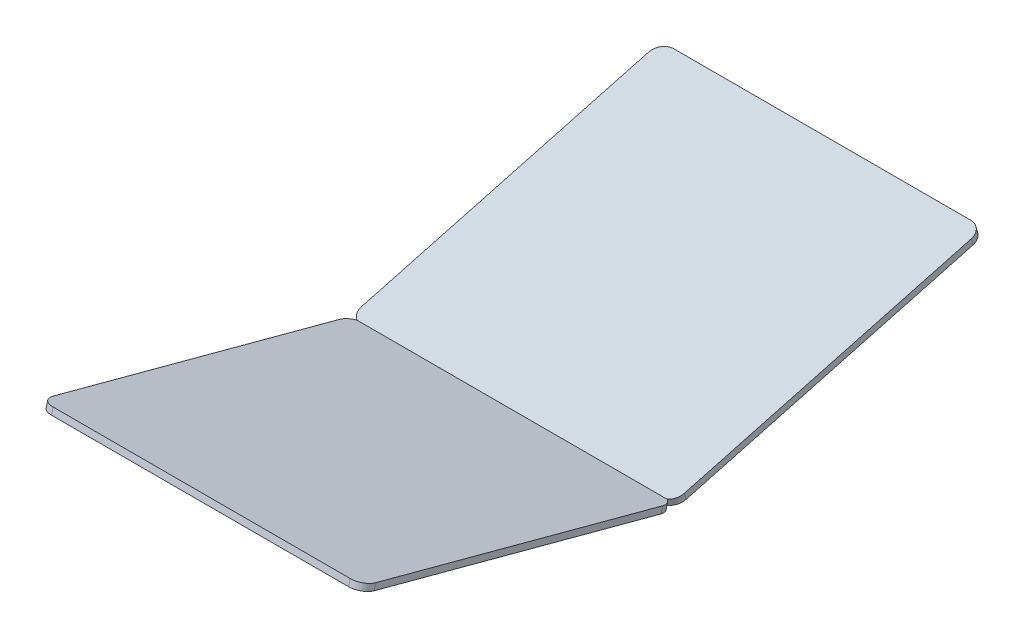
ISO-10303-21;
HEADER;
FILE_DESCRIPTION(('STEP AP214'),'2;1');
FILE_NAME('part.step','',(''),(''),'','','');
FILE_SCHEMA(('AUTOMOTIVE_DESIGN { 1 0 10303 214 1 1 1 1 }'));
ENDSEC;
DATA;
#1=APPLICATION_CONTEXT('core data for automotive mechanical design processes');
#2=APPLICATION_PROTOCOL_DEFINITION('international standard','automotive_design',2000,#1);
#3=PRODUCT_CONTEXT('',#1,'mechanical');
#4=PRODUCT('Part','Part','',(#3));
#5=PRODUCT_RELATED_PRODUCT_CATEGORY('part','',(#4));
#6=PRODUCT_DEFINITION_FORMATION('','',#4);
#7=PRODUCT_DEFINITION_CONTEXT('part definition',#1,'design');
#8=PRODUCT_DEFINITION('design','',#6,#7);
#9=PRODUCT_DEFINITION_SHAPE('','',#8);
#10=(LENGTH_UNIT() NAMED_UNIT(*) SI_UNIT(.MILLI.,.METRE.));
#11=(NAMED_UNIT(*) PLANE_ANGLE_UNIT() SI_UNIT($,.RADIAN.));
#12=(NAMED_UNIT(*) SI_UNIT($,.STERADIAN.) SOLID_ANGLE_UNIT());
#13=UNCERTAINTY_MEASURE_WITH_UNIT(LENGTH_MEASURE(1.E-05),#10,'distance_accuracy_value','');
#14=(GEOMETRIC_REPRESENTATION_CONTEXT(3) GLOBAL_UNCERTAINTY_ASSIGNED_CONTEXT((#13)) GLOBAL_UNIT_ASSIGNED_CONTEXT((#10,
#11,#12)) REPRESENTATION_CONTEXT('',''));
#15=CARTESIAN_POINT('',(0.,0.,0.));
#16=DIRECTION('',(0.,0.,1.));
#17=DIRECTION('',(1.,0.,0.));
#18=AXIS2_PLACEMENT_3D('',#15,#16,#17);
#19=CARTESIAN_POINT('',(-11.5,0.482962913144534,0.129409522551261));
#20=DIRECTION('',(0.,0.258819045102521,-0.965925826289068));
#21=DIRECTION('',(-1.,0.,0.));
#22=AXIS2_PLACEMENT_3D('',#19,#20,#21);
#23=PLANE('',#22);
#24=DIRECTION('',(1.,0.,0.));
#25=VECTOR('',#24,1.);
#26=CARTESIAN_POINT('',(-11.5,0.,0.));
#27=LINE('',#26,#25);
#28=CARTESIAN_POINT('',(-11.5,0.,0.));
#29=VERTEX_POINT('',#28);
#30=CARTESIAN_POINT('',(11.5,0.,0.));
#31=VERTEX_POINT('',#30);
#32=EDGE_CURVE('E98',#29,#31,#27,.T.);
#33=ORIENTED_EDGE('',*,*,#32,.F.);
#34=DIRECTION('',(0.,-0.965925826289068,-0.258819045102521));
#35=VECTOR('',#34,1.);
#36=CARTESIAN_POINT('',(-11.5,0.482962913144534,0.129409522551261));
#37=LINE('',#36,#35);
#38=CARTESIAN_POINT('',(-11.5,0.482962913144534,0.129409522551261));
#39=VERTEX_POINT('',#38);
#40=EDGE_CURVE('E107',#39,#29,#37,.T.);
#41=ORIENTED_EDGE('',*,*,#40,.F.);
#42=DIRECTION('',(1.,0.,0.));
#43=VECTOR('',#42,1.);
#44=CARTESIAN_POINT('',(-11.5,0.482962913144534,0.129409522551261));
#45=LINE('',#44,#43);
#46=CARTESIAN_POINT('',(11.5,0.482962913144534,0.129409522551261));
#47=VERTEX_POINT('',#46);
#48=EDGE_CURVE('E49',#39,#47,#45,.T.);
#49=ORIENTED_EDGE('',*,*,#48,.T.);
#50=DIRECTION('',(0.,-0.965925826289068,-0.258819045102521));
#51=VECTOR('',#50,1.);
#52=CARTESIAN_POINT('',(11.5,0.482962913144534,0.129409522551261));
#53=LINE('',#52,#51);
#54=EDGE_CURVE('E110',#47,#31,#53,.T.);
#55=ORIENTED_EDGE('',*,*,#54,.T.);
#56=EDGE_LOOP('',(#33,#41,#49,#55));
#57=FACE_BOUND('',#56,.T.);
#58=ADVANCED_FACE('F45',(#57),#23,.T.);
#59=CARTESIAN_POINT('',(11.5,0.741781958247055,-0.836516303737807));
#60=DIRECTION('',(0.,-0.965925826289068,-0.258819045102521));
#61=DIRECTION('',(0.,0.258819045102521,-0.965925826289068));
#62=AXIS2_PLACEMENT_3D('',#59,#60,#61);
#63=CYLINDRICAL_SURFACE('',#62,0.999999999999999);
#64=ORIENTED_EDGE('',*,*,#54,.F.);
#65=CARTESIAN_POINT('',(11.5,0.741781958247055,-0.836516303737807));
#66=DIRECTION('',(0.,0.965925826289068,0.258819045102521));
#67=DIRECTION('',(0.,-0.258819045102521,0.965925826289068));
#68=AXIS2_PLACEMENT_3D('',#65,#66,#67);
#69=CIRCLE('',#68,0.999999999999999);
#70=CARTESIAN_POINT('',(12.,0.517638090205041,0.));
#71=VERTEX_POINT('',#70);
#72=EDGE_CURVE('E164',#47,#71,#69,.T.);
#73=ORIENTED_EDGE('',*,*,#72,.T.);
#74=CARTESIAN_POINT('',(11.5,3.86370330515626,0.));
#75=DIRECTION('',(0.,0.,-1.));
#76=DIRECTION('',(0.,-1.,0.));
#77=AXIS2_PLACEMENT_3D('',#74,#75,#76);
#78=ELLIPSE('',#77,3.86370330515626,1.);
#79=EDGE_CURVE('E126',#31,#71,#78,.F.);
#80=ORIENTED_EDGE('',*,*,#79,.F.);
#81=EDGE_LOOP('',(#64,#73,#80));
#82=FACE_BOUND('',#81,.T.);
#83=ADVANCED_FACE('F181',(#82),#63,.F.);
#84=CARTESIAN_POINT('',(-11.5,6.69461999560504,-23.0528103083864));
#85=DIRECTION('',(0.,-0.965925826289068,-0.258819045102521));
#86=DIRECTION('',(0.,0.258819045102521,-0.965925826289068));
#87=AXIS2_PLACEMENT_3D('',#84,#85,#86);
#88=PLANE('',#87);
#89=ORIENTED_EDGE('',*,*,#72,.F.);
#90=ORIENTED_EDGE('',*,*,#48,.F.);
#91=CARTESIAN_POINT('',(-11.5,0.741781958247055,-0.836516303737807));
#92=DIRECTION('',(0.,0.965925826289068,0.258819045102521));
#93=DIRECTION('',(0.,0.258819045102521,-0.965925826289068));
#94=AXIS2_PLACEMENT_3D('',#91,#92,#93);
#95=CIRCLE('',#94,1.);
#96=CARTESIAN_POINT('',(-12.,0.517638090205041,0.));
#97=VERTEX_POINT('',#96);
#98=EDGE_CURVE('E129',#97,#39,#95,.T.);
#99=ORIENTED_EDGE('',*,*,#98,.F.);
#100=DIRECTION('',(-1.,0.,0.));
#101=VECTOR('',#100,1.);
#102=CARTESIAN_POINT('',(-11.5,0.51763809020504,0.));
#103=LINE('',#102,#101);
#104=EDGE_CURVE('E113',#71,#97,#103,.T.);
#105=ORIENTED_EDGE('',*,*,#104,.F.);
#106=EDGE_LOOP('',(#89,#90,#99,#105));
#107=FACE_BOUND('',#106,.T.);
#108=ADVANCED_FACE('F172',(#107),#88,.T.);
#109=CARTESIAN_POINT('',(-11.5,0.741781958247055,-0.836516303737807));
#110=DIRECTION('',(0.,-0.965925826289068,-0.258819045102521));
#111=DIRECTION('',(0.,0.258819045102521,-0.965925826289068));
#112=AXIS2_PLACEMENT_3D('',#109,#110,#111);
#113=CYLINDRICAL_SURFACE('',#112,1.);
#114=ORIENTED_EDGE('',*,*,#98,.T.);
#115=ORIENTED_EDGE('',*,*,#40,.T.);
#116=CARTESIAN_POINT('',(-11.5,3.86370330515626,0.));
#117=DIRECTION('',(0.,0.,-1.));
#118=DIRECTION('',(0.,-1.,0.));
#119=AXIS2_PLACEMENT_3D('',#116,#117,#118);
#120=ELLIPSE('',#119,3.86370330515626,1.);
#121=EDGE_CURVE('E119',#97,#29,#120,.F.);
#122=ORIENTED_EDGE('',*,*,#121,.F.);
#123=EDGE_LOOP('',(#114,#115,#122));
#124=FACE_BOUND('',#123,.T.);
#125=ADVANCED_FACE('F128',(#124),#113,.F.);
#126=CARTESIAN_POINT('',(11.5,6.69461999560504,23.0528103083864));
#127=DIRECTION('',(0.,-0.965925826289068,0.258819045102521));
#128=DIRECTION('',(0.,0.258819045102521,0.965925826289068));
#129=AXIS2_PLACEMENT_3D('',#126,#127,#128);
#130=PLANE('',#129);
#131=CARTESIAN_POINT('',(11.5,0.741781958247055,0.836516303737807));
#132=DIRECTION('',(0.,0.965925826289068,-0.258819045102521));
#133=DIRECTION('',(0.,0.258819045102521,0.965925826289068));
#134=AXIS2_PLACEMENT_3D('',#131,#132,#133);
#135=CIRCLE('',#134,1.);
#136=CARTESIAN_POINT('',(12.5,0.741781958247055,0.836516303737807));
#137=VERTEX_POINT('',#136);
#138=EDGE_CURVE('E154',#137,#71,#135,.T.);
#139=ORIENTED_EDGE('',*,*,#138,.T.);
#140=ORIENTED_EDGE('',*,*,#104,.T.);
#141=CARTESIAN_POINT('',(-11.5,0.741781958247055,0.836516303737807));
#142=DIRECTION('',(0.,0.965925826289068,-0.258819045102521));
#143=DIRECTION('',(0.,-0.258819045102521,-0.965925826289068));
#144=AXIS2_PLACEMENT_3D('',#141,#142,#143);
#145=CIRCLE('',#144,0.999999999999999);
#146=CARTESIAN_POINT('',(-12.5,0.741781958247055,0.836516303737807));
#147=VERTEX_POINT('',#146);
#148=EDGE_CURVE('E123',#97,#147,#145,.T.);
#149=ORIENTED_EDGE('',*,*,#148,.T.);
#150=DIRECTION('',(0.,0.258819045102521,0.965925826289068));
#151=VECTOR('',#150,1.);
#152=CARTESIAN_POINT('',(-12.5,0.741781958247055,0.836516303737807));
#153=LINE('',#152,#151);
#154=CARTESIAN_POINT('',(-12.5,6.69461999560504,23.0528103083864));
#155=VERTEX_POINT('',#154);
#156=EDGE_CURVE('E149',#147,#155,#153,.T.);
#157=ORIENTED_EDGE('',*,*,#156,.T.);
#158=CARTESIAN_POINT('',(-11.5,6.69461999560504,23.0528103083864));
#159=DIRECTION('',(0.,0.965925826289068,-0.258819045102521));
#160=DIRECTION('',(0.,-0.258819045102521,-0.965925826289068));
#161=AXIS2_PLACEMENT_3D('',#158,#159,#160);
#162=CIRCLE('',#161,1.);
#163=CARTESIAN_POINT('',(-11.5,6.95343904070757,24.0187361346754));
#164=VERTEX_POINT('',#163);
#165=EDGE_CURVE('E146',#155,#164,#162,.T.);
#166=ORIENTED_EDGE('',*,*,#165,.T.);
#167=DIRECTION('',(1.,0.,0.));
#168=VECTOR('',#167,1.);
#169=CARTESIAN_POINT('',(11.5,6.95343904070757,24.0187361346754));
#170=LINE('',#169,#168);
#171=CARTESIAN_POINT('',(11.5,6.95343904070757,24.0187361346754));
#172=VERTEX_POINT('',#171);
#173=EDGE_CURVE('E144',#164,#172,#170,.T.);
#174=ORIENTED_EDGE('',*,*,#173,.T.);
#175=CARTESIAN_POINT('',(11.5,6.69461999560504,23.0528103083864));
#176=DIRECTION('',(0.,0.965925826289068,-0.258819045102521));
#177=DIRECTION('',(0.,0.258819045102521,0.965925826289068));
#178=AXIS2_PLACEMENT_3D('',#175,#176,#177);
#179=CIRCLE('',#178,1.);
#180=CARTESIAN_POINT('',(12.5,6.69461999560504,23.0528103083864));
#181=VERTEX_POINT('',#180);
#182=EDGE_CURVE('E153',#172,#181,#179,.T.);
#183=ORIENTED_EDGE('',*,*,#182,.T.);
#184=DIRECTION('',(0.,-0.258819045102521,-0.965925826289068));
#185=VECTOR('',#184,1.);
#186=CARTESIAN_POINT('',(12.5,0.741781958247055,0.836516303737807));
#187=LINE('',#186,#185);
#188=EDGE_CURVE('E151',#181,#137,#187,.T.);
#189=ORIENTED_EDGE('',*,*,#188,.T.);
#190=EDGE_LOOP('',(#139,#140,#149,#157,#166,#174,#183,#189));
#191=FACE_BOUND('',#190,.T.);
#192=ADVANCED_FACE('F174',(#191),#130,.F.);
#193=CARTESIAN_POINT('',(11.5,0.741781958247055,0.836516303737807));
#194=DIRECTION('',(0.,-0.965925826289068,0.258819045102521));
#195=DIRECTION('',(0.,0.258819045102521,0.965925826289068));
#196=AXIS2_PLACEMENT_3D('',#193,#194,#195);
#197=CYLINDRICAL_SURFACE('',#196,1.);
#198=CARTESIAN_POINT('',(11.5,0.258819045102521,0.965925826289068));
#199=DIRECTION('',(0.,0.965925826289068,-0.258819045102521));
#200=DIRECTION('',(0.,0.258819045102521,0.965925826289068));
#201=AXIS2_PLACEMENT_3D('',#198,#199,#200);
#202=CIRCLE('',#201,1.);
#203=CARTESIAN_POINT('',(12.5,0.258819045102521,0.965925826289068));
#204=VERTEX_POINT('',#203);
#205=EDGE_CURVE('E136',#204,#31,#202,.T.);
#206=ORIENTED_EDGE('',*,*,#205,.T.);
#207=ORIENTED_EDGE('',*,*,#79,.T.);
#208=ORIENTED_EDGE('',*,*,#138,.F.);
#209=DIRECTION('',(0.,-0.965925826289068,0.258819045102521));
#210=VECTOR('',#209,1.);
#211=CARTESIAN_POINT('',(12.5,0.741781958247055,0.836516303737807));
#212=LINE('',#211,#210);
#213=EDGE_CURVE('E180',#137,#204,#212,.T.);
#214=ORIENTED_EDGE('',*,*,#213,.T.);
#215=EDGE_LOOP('',(#206,#207,#208,#214));
#216=FACE_BOUND('',#215,.T.);
#217=ADVANCED_FACE('F179',(#216),#197,.T.);
#218=CARTESIAN_POINT('',(-11.5,0.741781958247055,0.836516303737807));
#219=DIRECTION('',(0.,-0.965925826289068,0.258819045102521));
#220=DIRECTION('',(0.,0.258819045102521,0.965925826289068));
#221=AXIS2_PLACEMENT_3D('',#218,#219,#220);
#222=CYLINDRICAL_SURFACE('',#221,0.999999999999999);
#223=ORIENTED_EDGE('',*,*,#148,.F.);
#224=ORIENTED_EDGE('',*,*,#121,.T.);
#225=CARTESIAN_POINT('',(-11.5,0.258819045102521,0.965925826289067));
#226=DIRECTION('',(0.,0.965925826289068,-0.258819045102521));
#227=DIRECTION('',(0.,-0.258819045102521,-0.965925826289068));
#228=AXIS2_PLACEMENT_3D('',#225,#226,#227);
#229=CIRCLE('',#228,0.999999999999999);
#230=CARTESIAN_POINT('',(-12.5,0.258819045102521,0.965925826289067));
#231=VERTEX_POINT('',#230);
#232=EDGE_CURVE('E121',#29,#231,#229,.T.);
#233=ORIENTED_EDGE('',*,*,#232,.T.);
#234=DIRECTION('',(0.,-0.965925826289068,0.258819045102521));
#235=VECTOR('',#234,1.);
#236=CARTESIAN_POINT('',(-12.5,0.741781958247055,0.836516303737807));
#237=LINE('',#236,#235);
#238=EDGE_CURVE('E320',#147,#231,#237,.T.);
#239=ORIENTED_EDGE('',*,*,#238,.F.);
#240=EDGE_LOOP('',(#223,#224,#233,#239));
#241=FACE_BOUND('',#240,.T.);
#242=ADVANCED_FACE('F47',(#241),#222,.T.);
#243=CARTESIAN_POINT('',(11.5,6.69461999560504,23.0528103083864));
#244=DIRECTION('',(0.,-0.965925826289068,0.258819045102521));
#245=DIRECTION('',(0.,0.258819045102521,0.965925826289068));
#246=AXIS2_PLACEMENT_3D('',#243,#244,#245);
#247=CYLINDRICAL_SURFACE('',#246,1.);
#248=CARTESIAN_POINT('',(11.5,6.21165708246051,23.1822198309376));
#249=DIRECTION('',(0.,0.965925826289068,-0.258819045102521));
#250=DIRECTION('',(0.,0.258819045102521,0.965925826289068));
#251=AXIS2_PLACEMENT_3D('',#248,#249,#250);
#252=CIRCLE('',#251,1.);
#253=CARTESIAN_POINT('',(11.5,6.47047612756303,24.1481456572267));
#254=VERTEX_POINT('',#253);
#255=CARTESIAN_POINT('',(12.5,6.21165708246051,23.1822198309376));
#256=VERTEX_POINT('',#255);
#257=EDGE_CURVE('E12',#254,#256,#252,.T.);
#258=ORIENTED_EDGE('',*,*,#257,.T.);
#259=DIRECTION('',(0.,-0.965925826289068,0.258819045102521));
#260=VECTOR('',#259,1.);
#261=CARTESIAN_POINT('',(12.5,6.69461999560504,23.0528103083864));
#262=LINE('',#261,#260);
#263=EDGE_CURVE('E112',#181,#256,#262,.T.);
#264=ORIENTED_EDGE('',*,*,#263,.F.);
#265=ORIENTED_EDGE('',*,*,#182,.F.);
#266=DIRECTION('',(0.,-0.965925826289068,0.258819045102521));
#267=VECTOR('',#266,1.);
#268=CARTESIAN_POINT('',(11.5,6.95343904070757,24.0187361346754));
#269=LINE('',#268,#267);
#270=EDGE_CURVE('E147',#172,#254,#269,.T.);
#271=ORIENTED_EDGE('',*,*,#270,.T.);
#272=EDGE_LOOP('',(#258,#264,#265,#271));
#273=FACE_BOUND('',#272,.T.);
#274=ADVANCED_FACE('F197',(#273),#247,.T.);
#275=CARTESIAN_POINT('',(12.5,0.741781958247055,0.836516303737807));
#276=DIRECTION('',(-1.,0.,0.));
#277=DIRECTION('',(0.,0.258819045102521,0.965925826289068));
#278=AXIS2_PLACEMENT_3D('',#275,#276,#277);
#279=PLANE('',#278);
#280=DIRECTION('',(0.,-0.258819045102521,-0.965925826289068));
#281=VECTOR('',#280,1.);
#282=CARTESIAN_POINT('',(12.5,0.258819045102521,0.965925826289068));
#283=LINE('',#282,#281);
#284=EDGE_CURVE('E55',#256,#204,#283,.T.);
#285=ORIENTED_EDGE('',*,*,#284,.T.);
#286=ORIENTED_EDGE('',*,*,#213,.F.);
#287=ORIENTED_EDGE('',*,*,#188,.F.);
#288=ORIENTED_EDGE('',*,*,#263,.T.);
#289=EDGE_LOOP('',(#285,#286,#287,#288));
#290=FACE_BOUND('',#289,.T.);
#291=ADVANCED_FACE('F201',(#290),#279,.F.);
#292=CARTESIAN_POINT('',(-12.5,0.741781958247055,0.836516303737807));
#293=DIRECTION('',(1.,0.,0.));
#294=DIRECTION('',(0.,-0.258819045102521,-0.965925826289068));
#295=AXIS2_PLACEMENT_3D('',#292,#293,#294);
#296=PLANE('',#295);
#297=DIRECTION('',(0.,0.258819045102521,0.965925826289068));
#298=VECTOR('',#297,1.);
#299=CARTESIAN_POINT('',(-12.5,0.258819045102521,0.965925826289067));
#300=LINE('',#299,#298);
#301=CARTESIAN_POINT('',(-12.5,6.21165708246051,23.1822198309376));
#302=VERTEX_POINT('',#301);
#303=EDGE_CURVE('E135',#231,#302,#300,.T.);
#304=ORIENTED_EDGE('',*,*,#303,.T.);
#305=DIRECTION('',(0.,-0.965925826289068,0.258819045102521));
#306=VECTOR('',#305,1.);
#307=CARTESIAN_POINT('',(-12.5,6.69461999560504,23.0528103083864));
#308=LINE('',#307,#306);
#309=EDGE_CURVE('E308',#155,#302,#308,.T.);
#310=ORIENTED_EDGE('',*,*,#309,.F.);
#311=ORIENTED_EDGE('',*,*,#156,.F.);
#312=ORIENTED_EDGE('',*,*,#238,.T.);
#313=EDGE_LOOP('',(#304,#310,#311,#312));
#314=FACE_BOUND('',#313,.T.);
#315=ADVANCED_FACE('F207',(#314),#296,.F.);
#316=CARTESIAN_POINT('',(-11.5,6.69461999560504,23.0528103083864));
#317=DIRECTION('',(0.,-0.965925826289068,0.258819045102521));
#318=DIRECTION('',(0.,0.258819045102521,0.965925826289068));
#319=AXIS2_PLACEMENT_3D('',#316,#317,#318);
#320=CYLINDRICAL_SURFACE('',#319,1.);
#321=CARTESIAN_POINT('',(-11.5,6.21165708246051,23.1822198309376));
#322=DIRECTION('',(0.,0.965925826289068,-0.258819045102521));
#323=DIRECTION('',(0.,-0.258819045102521,-0.965925826289068));
#324=AXIS2_PLACEMENT_3D('',#321,#322,#323);
#325=CIRCLE('',#324,1.);
#326=CARTESIAN_POINT('',(-11.5,6.47047612756303,24.1481456572267));
#327=VERTEX_POINT('',#326);
#328=EDGE_CURVE('E139',#302,#327,#325,.T.);
#329=ORIENTED_EDGE('',*,*,#328,.T.);
#330=DIRECTION('',(0.,-0.965925826289068,0.258819045102521));
#331=VECTOR('',#330,1.);
#332=CARTESIAN_POINT('',(-11.5,6.95343904070757,24.0187361346754));
#333=LINE('',#332,#331);
#334=EDGE_CURVE('E303',#164,#327,#333,.T.);
#335=ORIENTED_EDGE('',*,*,#334,.F.);
#336=ORIENTED_EDGE('',*,*,#165,.F.);
#337=ORIENTED_EDGE('',*,*,#309,.T.);
#338=EDGE_LOOP('',(#329,#335,#336,#337));
#339=FACE_BOUND('',#338,.T.);
#340=ADVANCED_FACE('F213',(#339),#320,.T.);
#341=CARTESIAN_POINT('',(11.5,6.95343904070757,24.0187361346754));
#342=DIRECTION('',(0.,-0.258819045102521,-0.965925826289068));
#343=DIRECTION('',(-1.,0.,0.));
#344=AXIS2_PLACEMENT_3D('',#341,#342,#343);
#345=PLANE('',#344);
#346=DIRECTION('',(1.,0.,0.));
#347=VECTOR('',#346,1.);
#348=CARTESIAN_POINT('',(11.5,6.47047612756303,24.1481456572267));
#349=LINE('',#348,#347);
#350=EDGE_CURVE('E157',#327,#254,#349,.T.);
#351=ORIENTED_EDGE('',*,*,#350,.T.);
#352=ORIENTED_EDGE('',*,*,#270,.F.);
#353=ORIENTED_EDGE('',*,*,#173,.F.);
#354=ORIENTED_EDGE('',*,*,#334,.T.);
#355=EDGE_LOOP('',(#351,#352,#353,#354));
#356=FACE_BOUND('',#355,.T.);
#357=ADVANCED_FACE('F217',(#356),#345,.F.);
#358=CARTESIAN_POINT('',(11.5,6.21165708246051,23.1822198309376));
#359=DIRECTION('',(0.,-0.965925826289068,0.258819045102521));
#360=DIRECTION('',(0.,0.258819045102521,0.965925826289068));
#361=AXIS2_PLACEMENT_3D('',#358,#359,#360);
#362=PLANE('',#361);
#363=ORIENTED_EDGE('',*,*,#257,.F.);
#364=ORIENTED_EDGE('',*,*,#350,.F.);
#365=ORIENTED_EDGE('',*,*,#328,.F.);
#366=ORIENTED_EDGE('',*,*,#303,.F.);
#367=ORIENTED_EDGE('',*,*,#232,.F.);
#368=ORIENTED_EDGE('',*,*,#32,.T.);
#369=ORIENTED_EDGE('',*,*,#205,.F.);
#370=ORIENTED_EDGE('',*,*,#284,.F.);
#371=EDGE_LOOP('',(#363,#364,#365,#366,#367,#368,#369,#370));
#372=FACE_BOUND('',#371,.T.);
#373=ADVANCED_FACE('F132',(#372),#362,.T.);
#374=CLOSED_SHELL('',(#58,#83,#108,#125,#192,#217,#242,#274,#291,#315,#340,#357,#373));
#375=MANIFOLD_SOLID_BREP('B2',#374);
#376=CARTESIAN_POINT('',(11.5,0.482962913144534,-0.129409522551261));
#377=DIRECTION('',(0.,0.258819045102521,0.965925826289068));
#378=DIRECTION('',(1.,0.,0.));
#379=AXIS2_PLACEMENT_3D('',#376,#377,#378);
#380=PLANE('',#379);
#381=DIRECTION('',(1.,0.,0.));
#382=VECTOR('',#381,1.);
#383=CARTESIAN_POINT('',(-11.5,0.,0.));
#384=LINE('',#383,#382);
#385=CARTESIAN_POINT('',(-11.5,0.,0.));
#386=VERTEX_POINT('',#385);
#387=CARTESIAN_POINT('',(11.5,0.,0.));
#388=VERTEX_POINT('',#387);
#389=EDGE_CURVE('E436',#386,#388,#384,.T.);
#390=ORIENTED_EDGE('',*,*,#389,.T.);
#391=DIRECTION('',(0.,-0.965925826289068,0.258819045102521));
#392=VECTOR('',#391,1.);
#393=CARTESIAN_POINT('',(11.5,0.482962913144534,-0.129409522551261));
#394=LINE('',#393,#392);
#395=CARTESIAN_POINT('',(11.5,0.482962913144534,-0.129409522551261));
#396=VERTEX_POINT('',#395);
#397=EDGE_CURVE('E442',#396,#388,#394,.T.);
#398=ORIENTED_EDGE('',*,*,#397,.F.);
#399=DIRECTION('',(-1.,0.,0.));
#400=VECTOR('',#399,1.);
#401=CARTESIAN_POINT('',(11.5,0.482962913144534,-0.129409522551261));
#402=LINE('',#401,#400);
#403=CARTESIAN_POINT('',(-11.5,0.482962913144534,-0.129409522551261));
#404=VERTEX_POINT('',#403);
#405=EDGE_CURVE('E336',#396,#404,#402,.T.);
#406=ORIENTED_EDGE('',*,*,#405,.T.);
#407=DIRECTION('',(0.,-0.965925826289068,0.258819045102521));
#408=VECTOR('',#407,1.);
#409=CARTESIAN_POINT('',(-11.5,0.482962913144534,-0.129409522551261));
#410=LINE('',#409,#408);
#411=EDGE_CURVE('E351',#404,#386,#410,.T.);
#412=ORIENTED_EDGE('',*,*,#411,.T.);
#413=EDGE_LOOP('',(#390,#398,#406,#412));
#414=FACE_BOUND('',#413,.T.);
#415=ADVANCED_FACE('F327',(#414),#380,.T.);
#416=CARTESIAN_POINT('',(-11.5,0.741781958247055,0.836516303737807));
#417=DIRECTION('',(0.,-0.965925826289068,0.258819045102521));
#418=DIRECTION('',(0.,0.258819045102521,0.965925826289068));
#419=AXIS2_PLACEMENT_3D('',#416,#417,#418);
#420=CYLINDRICAL_SURFACE('',#419,0.999999999999999);
#421=CARTESIAN_POINT('',(-11.5,3.86370330515626,0.));
#422=DIRECTION('',(0.,0.,-1.));
#423=DIRECTION('',(0.,-1.,0.));
#424=AXIS2_PLACEMENT_3D('',#421,#422,#423);
#425=ELLIPSE('',#424,3.86370330515626,1.);
#426=CARTESIAN_POINT('',(-12.,0.517638090205041,0.));
#427=VERTEX_POINT('',#426);
#428=EDGE_CURVE('E428',#427,#386,#425,.F.);
#429=ORIENTED_EDGE('',*,*,#428,.T.);
#430=ORIENTED_EDGE('',*,*,#411,.F.);
#431=CARTESIAN_POINT('',(-11.5,0.741781958247055,0.836516303737807));
#432=DIRECTION('',(0.,0.965925826289068,-0.258819045102521));
#433=DIRECTION('',(0.,-0.258819045102521,-0.965925826289068));
#434=AXIS2_PLACEMENT_3D('',#431,#432,#433);
#435=CIRCLE('',#434,0.999999999999999);
#436=EDGE_CURVE('E439',#404,#427,#435,.T.);
#437=ORIENTED_EDGE('',*,*,#436,.T.);
#438=EDGE_LOOP('',(#429,#430,#437));
#439=FACE_BOUND('',#438,.T.);
#440=ADVANCED_FACE('F498',(#439),#420,.F.);
#441=CARTESIAN_POINT('',(11.5,6.69461999560504,23.0528103083864));
#442=DIRECTION('',(0.,-0.965925826289068,0.258819045102521));
#443=DIRECTION('',(0.,0.258819045102521,0.965925826289068));
#444=AXIS2_PLACEMENT_3D('',#441,#442,#443);
#445=PLANE('',#444);
#446=DIRECTION('',(-1.,0.,0.));
#447=VECTOR('',#446,1.);
#448=CARTESIAN_POINT('',(-11.5,0.51763809020504,0.));
#449=LINE('',#448,#447);
#450=CARTESIAN_POINT('',(12.,0.517638090205041,0.));
#451=VERTEX_POINT('',#450);
#452=EDGE_CURVE('E434',#451,#427,#449,.T.);
#453=ORIENTED_EDGE('',*,*,#452,.T.);
#454=ORIENTED_EDGE('',*,*,#436,.F.);
#455=ORIENTED_EDGE('',*,*,#405,.F.);
#456=CARTESIAN_POINT('',(11.5,0.741781958247055,0.836516303737807));
#457=DIRECTION('',(0.,0.965925826289068,-0.258819045102521));
#458=DIRECTION('',(0.,0.258819045102521,0.965925826289068));
#459=AXIS2_PLACEMENT_3D('',#456,#457,#458);
#460=CIRCLE('',#459,1.);
#461=EDGE_CURVE('E43',#451,#396,#460,.T.);
#462=ORIENTED_EDGE('',*,*,#461,.F.);
#463=EDGE_LOOP('',(#453,#454,#455,#462));
#464=FACE_BOUND('',#463,.T.);
#465=ADVANCED_FACE('F499',(#464),#445,.T.);
#466=CARTESIAN_POINT('',(11.5,0.741781958247055,0.836516303737807));
#467=DIRECTION('',(0.,-0.965925826289068,0.258819045102521));
#468=DIRECTION('',(0.,0.258819045102521,0.965925826289068));
#469=AXIS2_PLACEMENT_3D('',#466,#467,#468);
#470=CYLINDRICAL_SURFACE('',#469,1.);
#471=CARTESIAN_POINT('',(11.5,3.86370330515626,0.));
#472=DIRECTION('',(0.,0.,-1.));
#473=DIRECTION('',(0.,-1.,0.));
#474=AXIS2_PLACEMENT_3D('',#471,#472,#473);
#475=ELLIPSE('',#474,3.86370330515626,1.);
#476=EDGE_CURVE('E331',#388,#451,#475,.F.);
#477=ORIENTED_EDGE('',*,*,#476,.T.);
#478=ORIENTED_EDGE('',*,*,#461,.T.);
#479=ORIENTED_EDGE('',*,*,#397,.T.);
#480=EDGE_LOOP('',(#477,#478,#479));
#481=FACE_BOUND('',#480,.T.);
#482=ADVANCED_FACE('F329',(#481),#470,.F.);
#483=CARTESIAN_POINT('',(-11.5,0.741781958247055,-0.836516303737807));
#484=DIRECTION('',(0.,-0.965925826289068,-0.258819045102521));
#485=DIRECTION('',(0.,0.258819045102521,-0.965925826289068));
#486=AXIS2_PLACEMENT_3D('',#483,#484,#485);
#487=CYLINDRICAL_SURFACE('',#486,1.);
#488=ORIENTED_EDGE('',*,*,#428,.F.);
#489=CARTESIAN_POINT('',(-11.5,0.741781958247055,-0.836516303737807));
#490=DIRECTION('',(0.,0.965925826289068,0.258819045102521));
#491=DIRECTION('',(0.,0.258819045102521,-0.965925826289068));
#492=AXIS2_PLACEMENT_3D('',#489,#490,#491);
#493=CIRCLE('',#492,1.);
#494=CARTESIAN_POINT('',(-12.5,0.741781958247055,-0.836516303737807));
#495=VERTEX_POINT('',#494);
#496=EDGE_CURVE('E413',#495,#427,#493,.T.);
#497=ORIENTED_EDGE('',*,*,#496,.F.);
#498=DIRECTION('',(0.,-0.965925826289068,-0.258819045102521));
#499=VECTOR('',#498,1.);
#500=CARTESIAN_POINT('',(-12.5,0.741781958247055,-0.836516303737807));
#501=LINE('',#500,#499);
#502=CARTESIAN_POINT('',(-12.5,0.258819045102521,-0.965925826289068));
#503=VERTEX_POINT('',#502);
#504=EDGE_CURVE('E409',#495,#503,#501,.T.);
#505=ORIENTED_EDGE('',*,*,#504,.T.);
#506=CARTESIAN_POINT('',(-11.5,0.258819045102521,-0.965925826289068));
#507=DIRECTION('',(0.,0.965925826289068,0.258819045102521));
#508=DIRECTION('',(0.,0.258819045102521,-0.965925826289068));
#509=AXIS2_PLACEMENT_3D('',#506,#507,#508);
#510=CIRCLE('',#509,1.);
#511=EDGE_CURVE('E451',#503,#386,#510,.T.);
#512=ORIENTED_EDGE('',*,*,#511,.T.);
#513=EDGE_LOOP('',(#488,#497,#505,#512));
#514=FACE_BOUND('',#513,.T.);
#515=ADVANCED_FACE('F497',(#514),#487,.T.);
#516=CARTESIAN_POINT('',(11.5,0.741781958247055,-0.836516303737807));
#517=DIRECTION('',(0.,-0.965925826289068,-0.258819045102521));
#518=DIRECTION('',(0.,0.258819045102521,-0.965925826289068));
#519=AXIS2_PLACEMENT_3D('',#516,#517,#518);
#520=CYLINDRICAL_SURFACE('',#519,0.999999999999999);
#521=ORIENTED_EDGE('',*,*,#476,.F.);
#522=CARTESIAN_POINT('',(11.5,0.258819045102521,-0.965925826289067));
#523=DIRECTION('',(0.,0.965925826289068,0.258819045102521));
#524=DIRECTION('',(0.,-0.258819045102521,0.965925826289068));
#525=AXIS2_PLACEMENT_3D('',#522,#523,#524);
#526=CIRCLE('',#525,0.999999999999999);
#527=CARTESIAN_POINT('',(12.5,0.258819045102521,-0.965925826289067));
#528=VERTEX_POINT('',#527);
#529=EDGE_CURVE('E453',#388,#528,#526,.T.);
#530=ORIENTED_EDGE('',*,*,#529,.T.);
#531=DIRECTION('',(0.,-0.965925826289068,-0.258819045102521));
#532=VECTOR('',#531,1.);
#533=CARTESIAN_POINT('',(12.5,0.741781958247055,-0.836516303737807));
#534=LINE('',#533,#532);
#535=CARTESIAN_POINT('',(12.5,0.741781958247055,-0.836516303737807));
#536=VERTEX_POINT('',#535);
#537=EDGE_CURVE('E430',#536,#528,#534,.T.);
#538=ORIENTED_EDGE('',*,*,#537,.F.);
#539=CARTESIAN_POINT('',(11.5,0.741781958247055,-0.836516303737807));
#540=DIRECTION('',(0.,0.965925826289068,0.258819045102521));
#541=DIRECTION('',(0.,-0.258819045102521,0.965925826289068));
#542=AXIS2_PLACEMENT_3D('',#539,#540,#541);
#543=CIRCLE('',#542,0.999999999999999);
#544=EDGE_CURVE('E500',#451,#536,#543,.T.);
#545=ORIENTED_EDGE('',*,*,#544,.F.);
#546=EDGE_LOOP('',(#521,#530,#538,#545));
#547=FACE_BOUND('',#546,.T.);
#548=ADVANCED_FACE('F503',(#547),#520,.T.);
#549=CARTESIAN_POINT('',(-11.5,6.69461999560504,-23.0528103083864));
#550=DIRECTION('',(0.,-0.965925826289068,-0.258819045102521));
#551=DIRECTION('',(0.,0.258819045102521,-0.965925826289068));
#552=AXIS2_PLACEMENT_3D('',#549,#550,#551);
#553=PLANE('',#552);
#554=ORIENTED_EDGE('',*,*,#452,.F.);
#555=ORIENTED_EDGE('',*,*,#544,.T.);
#556=DIRECTION('',(0.,0.258819045102521,-0.965925826289068));
#557=VECTOR('',#556,1.);
#558=CARTESIAN_POINT('',(12.5,0.741781958247055,-0.836516303737807));
#559=LINE('',#558,#557);
#560=CARTESIAN_POINT('',(12.5,6.69461999560504,-23.0528103083864));
#561=VERTEX_POINT('',#560);
#562=EDGE_CURVE('E474',#536,#561,#559,.T.);
#563=ORIENTED_EDGE('',*,*,#562,.T.);
#564=CARTESIAN_POINT('',(11.5,6.69461999560504,-23.0528103083864));
#565=DIRECTION('',(0.,0.965925826289068,0.258819045102521));
#566=DIRECTION('',(0.,-0.258819045102521,0.965925826289068));
#567=AXIS2_PLACEMENT_3D('',#564,#565,#566);
#568=CIRCLE('',#567,1.);
#569=CARTESIAN_POINT('',(11.5,6.95343904070757,-24.0187361346754));
#570=VERTEX_POINT('',#569);
#571=EDGE_CURVE('E488',#561,#570,#568,.T.);
#572=ORIENTED_EDGE('',*,*,#571,.T.);
#573=DIRECTION('',(-1.,0.,0.));
#574=VECTOR('',#573,1.);
#575=CARTESIAN_POINT('',(-11.5,6.95343904070757,-24.0187361346754));
#576=LINE('',#575,#574);
#577=CARTESIAN_POINT('',(-11.5,6.95343904070757,-24.0187361346754));
#578=VERTEX_POINT('',#577);
#579=EDGE_CURVE('E419',#570,#578,#576,.T.);
#580=ORIENTED_EDGE('',*,*,#579,.T.);
#581=CARTESIAN_POINT('',(-11.5,6.69461999560504,-23.0528103083864));
#582=DIRECTION('',(0.,0.965925826289068,0.258819045102521));
#583=DIRECTION('',(0.,0.258819045102521,-0.965925826289068));
#584=AXIS2_PLACEMENT_3D('',#581,#582,#583);
#585=CIRCLE('',#584,1.);
#586=CARTESIAN_POINT('',(-12.5,6.69461999560504,-23.0528103083864));
#587=VERTEX_POINT('',#586);
#588=EDGE_CURVE('E414',#578,#587,#585,.T.);
#589=ORIENTED_EDGE('',*,*,#588,.T.);
#590=DIRECTION('',(0.,-0.258819045102521,0.965925826289068));
#591=VECTOR('',#590,1.);
#592=CARTESIAN_POINT('',(-12.5,0.741781958247055,-0.836516303737807));
#593=LINE('',#592,#591);
#594=EDGE_CURVE('E402',#587,#495,#593,.T.);
#595=ORIENTED_EDGE('',*,*,#594,.T.);
#596=ORIENTED_EDGE('',*,*,#496,.T.);
#597=EDGE_LOOP('',(#554,#555,#563,#572,#580,#589,#595,#596));
#598=FACE_BOUND('',#597,.T.);
#599=ADVANCED_FACE('F417',(#598),#553,.F.);
#600=CARTESIAN_POINT('',(-11.5,6.69461999560504,-23.0528103083864));
#601=DIRECTION('',(0.,-0.965925826289068,-0.258819045102521));
#602=DIRECTION('',(0.,0.258819045102521,-0.965925826289068));
#603=AXIS2_PLACEMENT_3D('',#600,#601,#602);
#604=CYLINDRICAL_SURFACE('',#603,1.);
#605=CARTESIAN_POINT('',(-11.5,6.21165708246051,-23.1822198309376));
#606=DIRECTION('',(0.,0.965925826289068,0.258819045102521));
#607=DIRECTION('',(0.,0.258819045102521,-0.965925826289068));
#608=AXIS2_PLACEMENT_3D('',#605,#606,#607);
#609=CIRCLE('',#608,1.);
#610=CARTESIAN_POINT('',(-11.5,6.47047612756303,-24.1481456572267));
#611=VERTEX_POINT('',#610);
#612=CARTESIAN_POINT('',(-12.5,6.21165708246051,-23.1822198309376));
#613=VERTEX_POINT('',#612);
#614=EDGE_CURVE('E427',#611,#613,#609,.T.);
#615=ORIENTED_EDGE('',*,*,#614,.T.);
#616=DIRECTION('',(0.,-0.965925826289068,-0.258819045102521));
#617=VECTOR('',#616,1.);
#618=CARTESIAN_POINT('',(-12.5,6.69461999560504,-23.0528103083864));
#619=LINE('',#618,#617);
#620=EDGE_CURVE('E406',#587,#613,#619,.T.);
#621=ORIENTED_EDGE('',*,*,#620,.F.);
#622=ORIENTED_EDGE('',*,*,#588,.F.);
#623=DIRECTION('',(0.,-0.965925826289068,-0.258819045102521));
#624=VECTOR('',#623,1.);
#625=CARTESIAN_POINT('',(-11.5,6.95343904070757,-24.0187361346754));
#626=LINE('',#625,#624);
#627=EDGE_CURVE('E460',#578,#611,#626,.T.);
#628=ORIENTED_EDGE('',*,*,#627,.T.);
#629=EDGE_LOOP('',(#615,#621,#622,#628));
#630=FACE_BOUND('',#629,.T.);
#631=ADVANCED_FACE('F425',(#630),#604,.T.);
#632=CARTESIAN_POINT('',(-12.5,0.741781958247055,-0.836516303737807));
#633=DIRECTION('',(1.,0.,0.));
#634=DIRECTION('',(0.,0.258819045102521,-0.965925826289068));
#635=AXIS2_PLACEMENT_3D('',#632,#633,#634);
#636=PLANE('',#635);
#637=DIRECTION('',(0.,-0.258819045102521,0.965925826289068));
#638=VECTOR('',#637,1.);
#639=CARTESIAN_POINT('',(-12.5,0.258819045102521,-0.965925826289068));
#640=LINE('',#639,#638);
#641=EDGE_CURVE('E493',#613,#503,#640,.T.);
#642=ORIENTED_EDGE('',*,*,#641,.T.);
#643=ORIENTED_EDGE('',*,*,#504,.F.);
#644=ORIENTED_EDGE('',*,*,#594,.F.);
#645=ORIENTED_EDGE('',*,*,#620,.T.);
#646=EDGE_LOOP('',(#642,#643,#644,#645));
#647=FACE_BOUND('',#646,.T.);
#648=ADVANCED_FACE('F404',(#647),#636,.F.);
#649=CARTESIAN_POINT('',(12.5,0.741781958247055,-0.836516303737807));
#650=DIRECTION('',(-1.,0.,0.));
#651=DIRECTION('',(0.,-0.258819045102521,0.965925826289068));
#652=AXIS2_PLACEMENT_3D('',#649,#650,#651);
#653=PLANE('',#652);
#654=DIRECTION('',(0.,0.258819045102521,-0.965925826289068));
#655=VECTOR('',#654,1.);
#656=CARTESIAN_POINT('',(12.5,0.258819045102521,-0.965925826289067));
#657=LINE('',#656,#655);
#658=CARTESIAN_POINT('',(12.5,6.21165708246051,-23.1822198309376));
#659=VERTEX_POINT('',#658);
#660=EDGE_CURVE('E455',#528,#659,#657,.T.);
#661=ORIENTED_EDGE('',*,*,#660,.T.);
#662=DIRECTION('',(0.,-0.965925826289068,-0.258819045102521));
#663=VECTOR('',#662,1.);
#664=CARTESIAN_POINT('',(12.5,6.69461999560504,-23.0528103083864));
#665=LINE('',#664,#663);
#666=EDGE_CURVE('E465',#561,#659,#665,.T.);
#667=ORIENTED_EDGE('',*,*,#666,.F.);
#668=ORIENTED_EDGE('',*,*,#562,.F.);
#669=ORIENTED_EDGE('',*,*,#537,.T.);
#670=EDGE_LOOP('',(#661,#667,#668,#669));
#671=FACE_BOUND('',#670,.T.);
#672=ADVANCED_FACE('F472',(#671),#653,.F.);
#673=CARTESIAN_POINT('',(11.5,6.69461999560504,-23.0528103083864));
#674=DIRECTION('',(0.,-0.965925826289068,-0.258819045102521));
#675=DIRECTION('',(0.,0.258819045102521,-0.965925826289068));
#676=AXIS2_PLACEMENT_3D('',#673,#674,#675);
#677=CYLINDRICAL_SURFACE('',#676,1.);
#678=CARTESIAN_POINT('',(11.5,6.21165708246051,-23.1822198309376));
#679=DIRECTION('',(0.,0.965925826289068,0.258819045102521));
#680=DIRECTION('',(0.,-0.258819045102521,0.965925826289068));
#681=AXIS2_PLACEMENT_3D('',#678,#679,#680);
#682=CIRCLE('',#681,1.);
#683=CARTESIAN_POINT('',(11.5,6.47047612756303,-24.1481456572267));
#684=VERTEX_POINT('',#683);
#685=EDGE_CURVE('E457',#659,#684,#682,.T.);
#686=ORIENTED_EDGE('',*,*,#685,.T.);
#687=DIRECTION('',(0.,-0.965925826289068,-0.258819045102521));
#688=VECTOR('',#687,1.);
#689=CARTESIAN_POINT('',(11.5,6.95343904070757,-24.0187361346754));
#690=LINE('',#689,#688);
#691=EDGE_CURVE('E462',#570,#684,#690,.T.);
#692=ORIENTED_EDGE('',*,*,#691,.F.);
#693=ORIENTED_EDGE('',*,*,#571,.F.);
#694=ORIENTED_EDGE('',*,*,#666,.T.);
#695=EDGE_LOOP('',(#686,#692,#693,#694));
#696=FACE_BOUND('',#695,.T.);
#697=ADVANCED_FACE('F484',(#696),#677,.T.);
#698=CARTESIAN_POINT('',(-11.5,6.95343904070757,-24.0187361346754));
#699=DIRECTION('',(0.,-0.258819045102521,0.965925826289068));
#700=DIRECTION('',(1.,0.,0.));
#701=AXIS2_PLACEMENT_3D('',#698,#699,#700);
#702=PLANE('',#701);
#703=DIRECTION('',(-1.,0.,0.));
#704=VECTOR('',#703,1.);
#705=CARTESIAN_POINT('',(-11.5,6.47047612756303,-24.1481456572267));
#706=LINE('',#705,#704);
#707=EDGE_CURVE('E423',#684,#611,#706,.T.);
#708=ORIENTED_EDGE('',*,*,#707,.T.);
#709=ORIENTED_EDGE('',*,*,#627,.F.);
#710=ORIENTED_EDGE('',*,*,#579,.F.);
#711=ORIENTED_EDGE('',*,*,#691,.T.);
#712=EDGE_LOOP('',(#708,#709,#710,#711));
#713=FACE_BOUND('',#712,.T.);
#714=ADVANCED_FACE('F487',(#713),#702,.F.);
#715=CARTESIAN_POINT('',(-11.5,6.21165708246051,-23.1822198309376));
#716=DIRECTION('',(0.,-0.965925826289068,-0.258819045102521));
#717=DIRECTION('',(0.,0.258819045102521,-0.965925826289068));
#718=AXIS2_PLACEMENT_3D('',#715,#716,#717);
#719=PLANE('',#718);
#720=ORIENTED_EDGE('',*,*,#614,.F.);
#721=ORIENTED_EDGE('',*,*,#707,.F.);
#722=ORIENTED_EDGE('',*,*,#685,.F.);
#723=ORIENTED_EDGE('',*,*,#660,.F.);
#724=ORIENTED_EDGE('',*,*,#529,.F.);
#725=ORIENTED_EDGE('',*,*,#389,.F.);
#726=ORIENTED_EDGE('',*,*,#511,.F.);
#727=ORIENTED_EDGE('',*,*,#641,.F.);
#728=EDGE_LOOP('',(#720,#721,#722,#723,#724,#725,#726,#727));
#729=FACE_BOUND('',#728,.T.);
#730=ADVANCED_FACE('F480',(#729),#719,.T.);
#731=CLOSED_SHELL('',(#415,#440,#465,#482,#515,#548,#599,#631,#648,#672,#697,#714,#730));
#732=MANIFOLD_SOLID_BREP('B6',#731);
#733=ADVANCED_BREP_SHAPE_REPRESENTATION('',(#18,#375,#732),#14);
#734=SHAPE_DEFINITION_REPRESENTATION(#9,#733);
ENDSEC;
END-ISO-10303-21;
